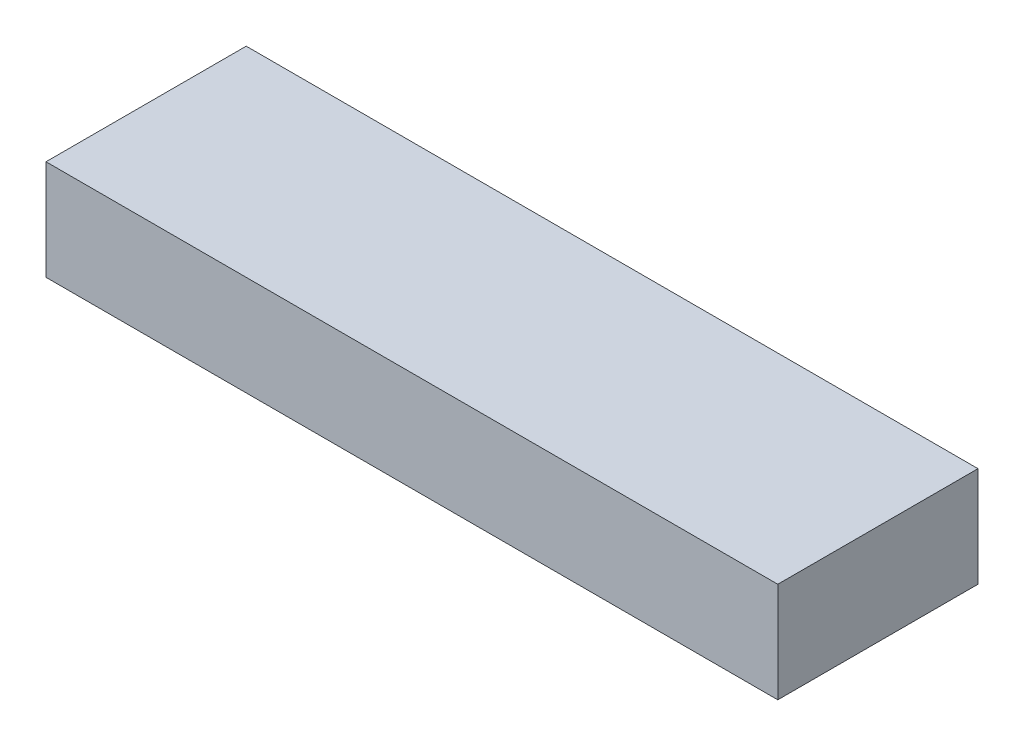
ISO-10303-21;
HEADER;
FILE_DESCRIPTION(('STEP AP214'),'2;1');
FILE_NAME('part.step','',(''),(''),'','','');
FILE_SCHEMA(('AUTOMOTIVE_DESIGN { 1 0 10303 214 1 1 1 1 }'));
ENDSEC;
DATA;
#1=APPLICATION_CONTEXT('core data for automotive mechanical design processes');
#2=APPLICATION_PROTOCOL_DEFINITION('international standard','automotive_design',2000,#1);
#3=PRODUCT_CONTEXT('',#1,'mechanical');
#4=PRODUCT('Part','Part','',(#3));
#5=PRODUCT_RELATED_PRODUCT_CATEGORY('part','',(#4));
#6=PRODUCT_DEFINITION_FORMATION('','',#4);
#7=PRODUCT_DEFINITION_CONTEXT('part definition',#1,'design');
#8=PRODUCT_DEFINITION('design','',#6,#7);
#9=PRODUCT_DEFINITION_SHAPE('','',#8);
#10=(LENGTH_UNIT() NAMED_UNIT(*) SI_UNIT(.MILLI.,.METRE.));
#11=(NAMED_UNIT(*) PLANE_ANGLE_UNIT() SI_UNIT($,.RADIAN.));
#12=(NAMED_UNIT(*) SI_UNIT($,.STERADIAN.) SOLID_ANGLE_UNIT());
#13=UNCERTAINTY_MEASURE_WITH_UNIT(LENGTH_MEASURE(1.E-05),#10,'distance_accuracy_value','');
#14=(GEOMETRIC_REPRESENTATION_CONTEXT(3) GLOBAL_UNCERTAINTY_ASSIGNED_CONTEXT((#13)) GLOBAL_UNIT_ASSIGNED_CONTEXT((#10,
#11,#12)) REPRESENTATION_CONTEXT('',''));
#15=CARTESIAN_POINT('',(0.,0.,0.));
#16=DIRECTION('',(0.,0.,1.));
#17=DIRECTION('',(1.,0.,0.));
#18=AXIS2_PLACEMENT_3D('',#15,#16,#17);
#19=CARTESIAN_POINT('',(0.,10.,0.));
#20=DIRECTION('',(1.,0.,0.));
#21=DIRECTION('',(0.,0.,-1.));
#22=AXIS2_PLACEMENT_3D('',#19,#20,#21);
#23=PLANE('',#22);
#24=DIRECTION('',(0.,0.,1.));
#25=VECTOR('',#24,1.);
#26=CARTESIAN_POINT('',(0.,0.,0.));
#27=LINE('',#26,#25);
#28=CARTESIAN_POINT('',(0.,0.,-20.));
#29=VERTEX_POINT('',#28);
#30=CARTESIAN_POINT('',(0.,0.,0.));
#31=VERTEX_POINT('',#30);
#32=EDGE_CURVE('E106',#29,#31,#27,.T.);
#33=ORIENTED_EDGE('',*,*,#32,.T.);
#34=DIRECTION('',(0.,-1.,0.));
#35=VECTOR('',#34,1.);
#36=CARTESIAN_POINT('',(0.,10.,0.));
#37=LINE('',#36,#35);
#38=CARTESIAN_POINT('',(0.,10.,0.));
#39=VERTEX_POINT('',#38);
#40=EDGE_CURVE('E11',#39,#31,#37,.T.);
#41=ORIENTED_EDGE('',*,*,#40,.F.);
#42=DIRECTION('',(0.,0.,1.));
#43=VECTOR('',#42,1.);
#44=CARTESIAN_POINT('',(0.,10.,0.));
#45=LINE('',#44,#43);
#46=CARTESIAN_POINT('',(0.,10.,-20.));
#47=VERTEX_POINT('',#46);
#48=EDGE_CURVE('E92',#47,#39,#45,.T.);
#49=ORIENTED_EDGE('',*,*,#48,.F.);
#50=DIRECTION('',(0.,-1.,0.));
#51=VECTOR('',#50,1.);
#52=CARTESIAN_POINT('',(0.,10.,-20.));
#53=LINE('',#52,#51);
#54=EDGE_CURVE('E105',#47,#29,#53,.T.);
#55=ORIENTED_EDGE('',*,*,#54,.T.);
#56=EDGE_LOOP('',(#33,#41,#49,#55));
#57=FACE_BOUND('',#56,.T.);
#58=ADVANCED_FACE('F43',(#57),#23,.F.);
#59=CARTESIAN_POINT('',(0.,10.,0.));
#60=DIRECTION('',(0.,0.,-1.));
#61=DIRECTION('',(-1.,0.,0.));
#62=AXIS2_PLACEMENT_3D('',#59,#60,#61);
#63=PLANE('',#62);
#64=DIRECTION('',(1.,0.,0.));
#65=VECTOR('',#64,1.);
#66=CARTESIAN_POINT('',(0.,0.,0.));
#67=LINE('',#66,#65);
#68=CARTESIAN_POINT('',(73.1,0.,0.));
#69=VERTEX_POINT('',#68);
#70=EDGE_CURVE('E97',#31,#69,#67,.T.);
#71=ORIENTED_EDGE('',*,*,#70,.T.);
#72=DIRECTION('',(0.,-1.,0.));
#73=VECTOR('',#72,1.);
#74=CARTESIAN_POINT('',(73.1,10.,0.));
#75=LINE('',#74,#73);
#76=CARTESIAN_POINT('',(73.1,10.,0.));
#77=VERTEX_POINT('',#76);
#78=EDGE_CURVE('E51',#77,#69,#75,.T.);
#79=ORIENTED_EDGE('',*,*,#78,.F.);
#80=DIRECTION('',(1.,0.,0.));
#81=VECTOR('',#80,1.);
#82=CARTESIAN_POINT('',(0.,10.,0.));
#83=LINE('',#82,#81);
#84=EDGE_CURVE('E87',#39,#77,#83,.T.);
#85=ORIENTED_EDGE('',*,*,#84,.F.);
#86=ORIENTED_EDGE('',*,*,#40,.T.);
#87=EDGE_LOOP('',(#71,#79,#85,#86));
#88=FACE_BOUND('',#87,.T.);
#89=ADVANCED_FACE('F100',(#88),#63,.F.);
#90=CARTESIAN_POINT('',(73.1,10.,0.));
#91=DIRECTION('',(-1.,0.,0.));
#92=DIRECTION('',(0.,0.,1.));
#93=AXIS2_PLACEMENT_3D('',#90,#91,#92);
#94=PLANE('',#93);
#95=DIRECTION('',(0.,0.,-1.));
#96=VECTOR('',#95,1.);
#97=CARTESIAN_POINT('',(73.1,0.,0.));
#98=LINE('',#97,#96);
#99=CARTESIAN_POINT('',(73.1,0.,-20.));
#100=VERTEX_POINT('',#99);
#101=EDGE_CURVE('E78',#69,#100,#98,.T.);
#102=ORIENTED_EDGE('',*,*,#101,.T.);
#103=DIRECTION('',(0.,-1.,0.));
#104=VECTOR('',#103,1.);
#105=CARTESIAN_POINT('',(73.1,10.,-20.));
#106=LINE('',#105,#104);
#107=CARTESIAN_POINT('',(73.1,10.,-20.));
#108=VERTEX_POINT('',#107);
#109=EDGE_CURVE('E98',#108,#100,#106,.T.);
#110=ORIENTED_EDGE('',*,*,#109,.F.);
#111=DIRECTION('',(0.,0.,-1.));
#112=VECTOR('',#111,1.);
#113=CARTESIAN_POINT('',(73.1,10.,0.));
#114=LINE('',#113,#112);
#115=EDGE_CURVE('E95',#77,#108,#114,.T.);
#116=ORIENTED_EDGE('',*,*,#115,.F.);
#117=ORIENTED_EDGE('',*,*,#78,.T.);
#118=EDGE_LOOP('',(#102,#110,#116,#117));
#119=FACE_BOUND('',#118,.T.);
#120=ADVANCED_FACE('F99',(#119),#94,.F.);
#121=CARTESIAN_POINT('',(0.,10.,-20.));
#122=DIRECTION('',(0.,0.,1.));
#123=DIRECTION('',(1.,0.,0.));
#124=AXIS2_PLACEMENT_3D('',#121,#122,#123);
#125=PLANE('',#124);
#126=DIRECTION('',(-1.,0.,0.));
#127=VECTOR('',#126,1.);
#128=CARTESIAN_POINT('',(0.,0.,-20.));
#129=LINE('',#128,#127);
#130=EDGE_CURVE('E85',#100,#29,#129,.T.);
#131=ORIENTED_EDGE('',*,*,#130,.T.);
#132=ORIENTED_EDGE('',*,*,#54,.F.);
#133=DIRECTION('',(-1.,0.,0.));
#134=VECTOR('',#133,1.);
#135=CARTESIAN_POINT('',(0.,10.,-20.));
#136=LINE('',#135,#134);
#137=EDGE_CURVE('E56',#108,#47,#136,.T.);
#138=ORIENTED_EDGE('',*,*,#137,.F.);
#139=ORIENTED_EDGE('',*,*,#109,.T.);
#140=EDGE_LOOP('',(#131,#132,#138,#139));
#141=FACE_BOUND('',#140,.T.);
#142=ADVANCED_FACE('F111',(#141),#125,.F.);
#143=CARTESIAN_POINT('',(0.,10.,0.));
#144=DIRECTION('',(0.,-1.,0.));
#145=DIRECTION('',(0.,0.,-1.));
#146=AXIS2_PLACEMENT_3D('',#143,#144,#145);
#147=PLANE('',#146);
#148=ORIENTED_EDGE('',*,*,#48,.T.);
#149=ORIENTED_EDGE('',*,*,#84,.T.);
#150=ORIENTED_EDGE('',*,*,#115,.T.);
#151=ORIENTED_EDGE('',*,*,#137,.T.);
#152=EDGE_LOOP('',(#148,#149,#150,#151));
#153=FACE_BOUND('',#152,.T.);
#154=ADVANCED_FACE('F89',(#153),#147,.F.);
#155=CARTESIAN_POINT('',(0.,0.,0.));
#156=DIRECTION('',(0.,-1.,0.));
#157=DIRECTION('',(0.,0.,-1.));
#158=AXIS2_PLACEMENT_3D('',#155,#156,#157);
#159=PLANE('',#158);
#160=ORIENTED_EDGE('',*,*,#32,.F.);
#161=ORIENTED_EDGE('',*,*,#130,.F.);
#162=ORIENTED_EDGE('',*,*,#101,.F.);
#163=ORIENTED_EDGE('',*,*,#70,.F.);
#164=EDGE_LOOP('',(#160,#161,#162,#163));
#165=FACE_BOUND('',#164,.T.);
#166=ADVANCED_FACE('F116',(#165),#159,.T.);
#167=CLOSED_SHELL('',(#58,#89,#120,#142,#154,#166));
#168=MANIFOLD_SOLID_BREP('B2',#167);
#169=ADVANCED_BREP_SHAPE_REPRESENTATION('',(#18,#168),#14);
#170=SHAPE_DEFINITION_REPRESENTATION(#9,#169);
ENDSEC;
END-ISO-10303-21;
